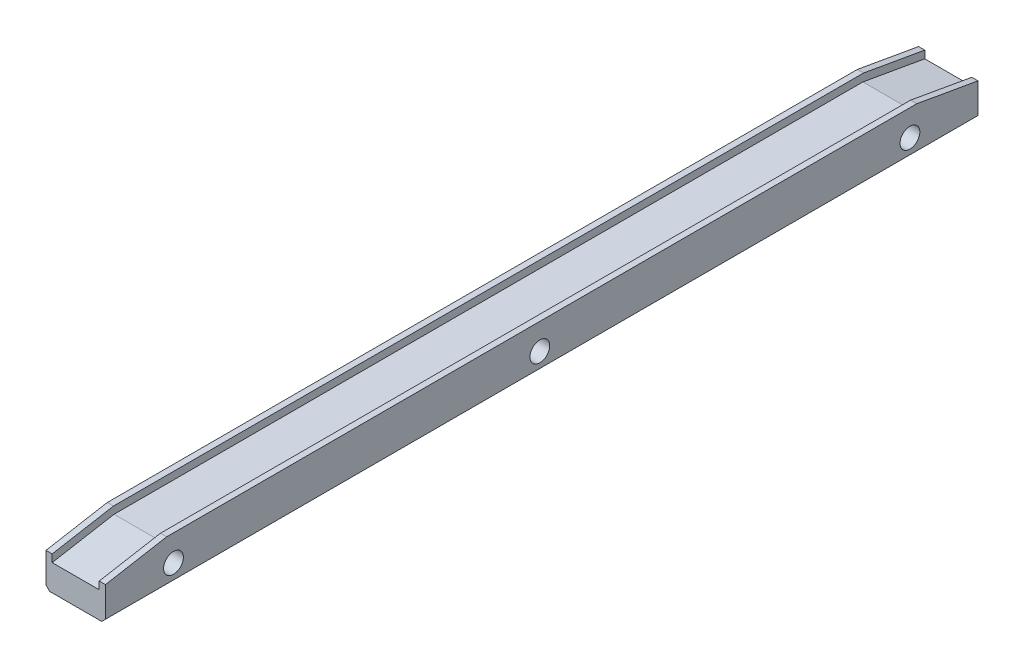
ISO-10303-21;
HEADER;
FILE_DESCRIPTION(('STEP AP214'),'2;1');
FILE_NAME('part.step','',(''),(''),'','','');
FILE_SCHEMA(('AUTOMOTIVE_DESIGN { 1 0 10303 214 1 1 1 1 }'));
ENDSEC;
DATA;
#1=APPLICATION_CONTEXT('core data for automotive mechanical design processes');
#2=APPLICATION_PROTOCOL_DEFINITION('international standard','automotive_design',2000,#1);
#3=PRODUCT_CONTEXT('',#1,'mechanical');
#4=PRODUCT('Part','Part','',(#3));
#5=PRODUCT_RELATED_PRODUCT_CATEGORY('part','',(#4));
#6=PRODUCT_DEFINITION_FORMATION('','',#4);
#7=PRODUCT_DEFINITION_CONTEXT('part definition',#1,'design');
#8=PRODUCT_DEFINITION('design','',#6,#7);
#9=PRODUCT_DEFINITION_SHAPE('','',#8);
#10=(LENGTH_UNIT() NAMED_UNIT(*) SI_UNIT(.MILLI.,.METRE.));
#11=(NAMED_UNIT(*) PLANE_ANGLE_UNIT() SI_UNIT($,.RADIAN.));
#12=(NAMED_UNIT(*) SI_UNIT($,.STERADIAN.) SOLID_ANGLE_UNIT());
#13=UNCERTAINTY_MEASURE_WITH_UNIT(LENGTH_MEASURE(1.E-05),#10,'distance_accuracy_value','');
#14=(GEOMETRIC_REPRESENTATION_CONTEXT(3) GLOBAL_UNCERTAINTY_ASSIGNED_CONTEXT((#13)) GLOBAL_UNIT_ASSIGNED_CONTEXT((#10,
#11,#12)) REPRESENTATION_CONTEXT('',''));
#15=CARTESIAN_POINT('',(0.,0.,0.));
#16=DIRECTION('',(0.,0.,1.));
#17=DIRECTION('',(1.,0.,0.));
#18=AXIS2_PLACEMENT_3D('',#15,#16,#17);
#19=CARTESIAN_POINT('',(-24.,6.,327.5));
#20=DIRECTION('',(1.,0.,0.));
#21=DIRECTION('',(0.,1.,0.));
#22=AXIS2_PLACEMENT_3D('',#19,#20,#21);
#23=PLANE('',#22);
#24=CARTESIAN_POINT('',(-24.,-15.,-297.5));
#25=DIRECTION('',(1.,0.,0.));
#26=DIRECTION('',(0.,1.,0.));
#27=AXIS2_PLACEMENT_3D('',#24,#25,#26);
#28=CIRCLE('',#27,7.99999999999998);
#29=CARTESIAN_POINT('',(-24.,-7.00000000000002,-297.5));
#30=VERTEX_POINT('',#29);
#31=EDGE_CURVE('E182',#30,#30,#28,.T.);
#32=ORIENTED_EDGE('',*,*,#31,.T.);
#33=EDGE_LOOP('',(#32));
#34=FACE_BOUND('',#33,.T.);
#35=CARTESIAN_POINT('',(-24.,-15.,297.5));
#36=DIRECTION('',(1.,0.,0.));
#37=DIRECTION('',(0.,1.,0.));
#38=AXIS2_PLACEMENT_3D('',#35,#36,#37);
#39=CIRCLE('',#38,7.99999999999998);
#40=CARTESIAN_POINT('',(-24.,-7.00000000000002,297.5));
#41=VERTEX_POINT('',#40);
#42=EDGE_CURVE('E187',#41,#41,#39,.T.);
#43=ORIENTED_EDGE('',*,*,#42,.T.);
#44=EDGE_LOOP('',(#43));
#45=FACE_BOUND('',#44,.T.);
#46=CARTESIAN_POINT('',(-24.,-15.,1.5));
#47=DIRECTION('',(1.,0.,0.));
#48=DIRECTION('',(0.,1.,0.));
#49=AXIS2_PLACEMENT_3D('',#46,#47,#48);
#50=CIRCLE('',#49,8.);
#51=CARTESIAN_POINT('',(-24.,-7.00000000000001,1.5));
#52=VERTEX_POINT('',#51);
#53=EDGE_CURVE('E287',#52,#52,#50,.T.);
#54=ORIENTED_EDGE('',*,*,#53,.T.);
#55=EDGE_LOOP('',(#54));
#56=FACE_BOUND('',#55,.T.);
#57=DIRECTION('',(0.,1.,0.));
#58=VECTOR('',#57,1.);
#59=CARTESIAN_POINT('',(-24.,-30.,-352.5));
#60=LINE('',#59,#58);
#61=CARTESIAN_POINT('',(-24.,-27.,-352.5));
#62=VERTEX_POINT('',#61);
#63=CARTESIAN_POINT('',(-24.,-2.72378936410878,-352.5));
#64=VERTEX_POINT('',#63);
#65=EDGE_CURVE('E254',#62,#64,#60,.T.);
#66=ORIENTED_EDGE('',*,*,#65,.F.);
#67=DIRECTION('',(0.,0.,1.));
#68=VECTOR('',#67,1.);
#69=CARTESIAN_POINT('',(-24.,-27.,327.5));
#70=LINE('',#69,#68);
#71=CARTESIAN_POINT('',(-24.,-27.,352.5));
#72=VERTEX_POINT('',#71);
#73=EDGE_CURVE('E65',#62,#72,#70,.T.);
#74=ORIENTED_EDGE('',*,*,#73,.T.);
#75=DIRECTION('',(0.,-1.,0.));
#76=VECTOR('',#75,1.);
#77=CARTESIAN_POINT('',(-24.,6.,352.5));
#78=LINE('',#77,#76);
#79=CARTESIAN_POINT('',(-24.,-2.72378936410878,352.5));
#80=VERTEX_POINT('',#79);
#81=EDGE_CURVE('E174',#80,#72,#78,.T.);
#82=ORIENTED_EDGE('',*,*,#81,.F.);
#83=DIRECTION('',(0.,0.173648177666928,-0.984807753012209));
#84=VECTOR('',#83,1.);
#85=CARTESIAN_POINT('',(-24.,-2.72378936410878,352.5));
#86=LINE('',#85,#84);
#87=CARTESIAN_POINT('',(-24.,6.,303.024931981155));
#88=VERTEX_POINT('',#87);
#89=EDGE_CURVE('E160',#80,#88,#86,.T.);
#90=ORIENTED_EDGE('',*,*,#89,.T.);
#91=DIRECTION('',(0.,0.,-1.));
#92=VECTOR('',#91,1.);
#93=CARTESIAN_POINT('',(-24.,6.,327.5));
#94=LINE('',#93,#92);
#95=CARTESIAN_POINT('',(-24.,6.,-303.024931981155));
#96=VERTEX_POINT('',#95);
#97=EDGE_CURVE('E173',#88,#96,#94,.T.);
#98=ORIENTED_EDGE('',*,*,#97,.T.);
#99=DIRECTION('',(0.,-0.173648177666928,-0.984807753012209));
#100=VECTOR('',#99,1.);
#101=CARTESIAN_POINT('',(-24.,-2.72378936410878,-352.5));
#102=LINE('',#101,#100);
#103=EDGE_CURVE('E257',#96,#64,#102,.T.);
#104=ORIENTED_EDGE('',*,*,#103,.T.);
#105=EDGE_LOOP('',(#66,#74,#82,#90,#98,#104));
#106=FACE_BOUND('',#105,.T.);
#107=ADVANCED_FACE('F41',(#34,#45,#56,#106),#23,.F.);
#108=CARTESIAN_POINT('',(24.,-30.,327.5));
#109=DIRECTION('',(0.,1.,0.));
#110=DIRECTION('',(0.,0.,1.));
#111=AXIS2_PLACEMENT_3D('',#108,#109,#110);
#112=PLANE('',#111);
#113=DIRECTION('',(1.,0.,0.));
#114=VECTOR('',#113,1.);
#115=CARTESIAN_POINT('',(-24.,-30.,352.5));
#116=LINE('',#115,#114);
#117=CARTESIAN_POINT('',(-21.,-30.,352.5));
#118=VERTEX_POINT('',#117);
#119=CARTESIAN_POINT('',(21.0000000000001,-30.,352.5));
#120=VERTEX_POINT('',#119);
#121=EDGE_CURVE('E240',#118,#120,#116,.T.);
#122=ORIENTED_EDGE('',*,*,#121,.F.);
#123=DIRECTION('',(0.,0.,-1.));
#124=VECTOR('',#123,1.);
#125=CARTESIAN_POINT('',(-21.,-30.,327.5));
#126=LINE('',#125,#124);
#127=CARTESIAN_POINT('',(-21.,-30.,-352.5));
#128=VERTEX_POINT('',#127);
#129=EDGE_CURVE('E229',#118,#128,#126,.T.);
#130=ORIENTED_EDGE('',*,*,#129,.T.);
#131=DIRECTION('',(-1.,0.,0.));
#132=VECTOR('',#131,1.);
#133=CARTESIAN_POINT('',(24.,-30.,-352.5));
#134=LINE('',#133,#132);
#135=CARTESIAN_POINT('',(21.0000000000001,-30.,-352.5));
#136=VERTEX_POINT('',#135);
#137=EDGE_CURVE('E256',#136,#128,#134,.T.);
#138=ORIENTED_EDGE('',*,*,#137,.F.);
#139=DIRECTION('',(0.,0.,1.));
#140=VECTOR('',#139,1.);
#141=CARTESIAN_POINT('',(21.0000000000001,-30.,327.5));
#142=LINE('',#141,#140);
#143=EDGE_CURVE('E227',#136,#120,#142,.T.);
#144=ORIENTED_EDGE('',*,*,#143,.T.);
#145=EDGE_LOOP('',(#122,#130,#138,#144));
#146=FACE_BOUND('',#145,.T.);
#147=ADVANCED_FACE('F244',(#146),#112,.F.);
#148=CARTESIAN_POINT('',(24.,6.,327.5));
#149=DIRECTION('',(-1.,0.,0.));
#150=DIRECTION('',(0.,-1.,0.));
#151=AXIS2_PLACEMENT_3D('',#148,#149,#150);
#152=PLANE('',#151);
#153=CARTESIAN_POINT('',(24.,-15.,-297.5));
#154=DIRECTION('',(1.,0.,0.));
#155=DIRECTION('',(0.,1.,0.));
#156=AXIS2_PLACEMENT_3D('',#153,#154,#155);
#157=CIRCLE('',#156,7.99999999999998);
#158=CARTESIAN_POINT('',(24.,-7.00000000000002,-297.5));
#159=VERTEX_POINT('',#158);
#160=EDGE_CURVE('E278',#159,#159,#157,.T.);
#161=ORIENTED_EDGE('',*,*,#160,.F.);
#162=EDGE_LOOP('',(#161));
#163=FACE_BOUND('',#162,.T.);
#164=CARTESIAN_POINT('',(24.,-15.,297.5));
#165=DIRECTION('',(1.,0.,0.));
#166=DIRECTION('',(0.,1.,0.));
#167=AXIS2_PLACEMENT_3D('',#164,#165,#166);
#168=CIRCLE('',#167,7.99999999999998);
#169=CARTESIAN_POINT('',(24.,-7.00000000000001,297.5));
#170=VERTEX_POINT('',#169);
#171=EDGE_CURVE('E279',#170,#170,#168,.T.);
#172=ORIENTED_EDGE('',*,*,#171,.F.);
#173=EDGE_LOOP('',(#172));
#174=FACE_BOUND('',#173,.T.);
#175=CARTESIAN_POINT('',(24.,-15.,1.5));
#176=DIRECTION('',(1.,0.,0.));
#177=DIRECTION('',(0.,1.,0.));
#178=AXIS2_PLACEMENT_3D('',#175,#176,#177);
#179=CIRCLE('',#178,8.);
#180=CARTESIAN_POINT('',(24.,-7.,1.5));
#181=VERTEX_POINT('',#180);
#182=EDGE_CURVE('E282',#181,#181,#179,.T.);
#183=ORIENTED_EDGE('',*,*,#182,.F.);
#184=EDGE_LOOP('',(#183));
#185=FACE_BOUND('',#184,.T.);
#186=DIRECTION('',(0.,1.,0.));
#187=VECTOR('',#186,1.);
#188=CARTESIAN_POINT('',(24.,-30.,352.5));
#189=LINE('',#188,#187);
#190=CARTESIAN_POINT('',(24.,-27.0000000000001,352.5));
#191=VERTEX_POINT('',#190);
#192=CARTESIAN_POINT('',(24.,-2.72378936410877,352.5));
#193=VERTEX_POINT('',#192);
#194=EDGE_CURVE('E248',#191,#193,#189,.T.);
#195=ORIENTED_EDGE('',*,*,#194,.F.);
#196=DIRECTION('',(0.,0.,-1.));
#197=VECTOR('',#196,1.);
#198=CARTESIAN_POINT('',(24.,-27.0000000000001,327.5));
#199=LINE('',#198,#197);
#200=CARTESIAN_POINT('',(24.,-27.0000000000001,-352.5));
#201=VERTEX_POINT('',#200);
#202=EDGE_CURVE('E11',#191,#201,#199,.T.);
#203=ORIENTED_EDGE('',*,*,#202,.T.);
#204=DIRECTION('',(0.,-1.,0.));
#205=VECTOR('',#204,1.);
#206=CARTESIAN_POINT('',(24.,6.,-352.5));
#207=LINE('',#206,#205);
#208=CARTESIAN_POINT('',(24.,-2.72378936410877,-352.5));
#209=VERTEX_POINT('',#208);
#210=EDGE_CURVE('E268',#209,#201,#207,.T.);
#211=ORIENTED_EDGE('',*,*,#210,.F.);
#212=DIRECTION('',(0.,-0.173648177666928,-0.984807753012209));
#213=VECTOR('',#212,1.);
#214=CARTESIAN_POINT('',(24.,-2.72378936410877,-352.5));
#215=LINE('',#214,#213);
#216=CARTESIAN_POINT('',(24.,6.,-303.024931981155));
#217=VERTEX_POINT('',#216);
#218=EDGE_CURVE('E607',#217,#209,#215,.T.);
#219=ORIENTED_EDGE('',*,*,#218,.F.);
#220=DIRECTION('',(0.,0.,-1.));
#221=VECTOR('',#220,1.);
#222=CARTESIAN_POINT('',(24.,6.,327.5));
#223=LINE('',#222,#221);
#224=CARTESIAN_POINT('',(24.,6.,303.024931981155));
#225=VERTEX_POINT('',#224);
#226=EDGE_CURVE('E199',#225,#217,#223,.T.);
#227=ORIENTED_EDGE('',*,*,#226,.F.);
#228=DIRECTION('',(0.,0.173648177666928,-0.984807753012209));
#229=VECTOR('',#228,1.);
#230=CARTESIAN_POINT('',(24.,-2.72378936410877,352.5));
#231=LINE('',#230,#229);
#232=EDGE_CURVE('E176',#193,#225,#231,.T.);
#233=ORIENTED_EDGE('',*,*,#232,.F.);
#234=EDGE_LOOP('',(#195,#203,#211,#219,#227,#233));
#235=FACE_BOUND('',#234,.T.);
#236=ADVANCED_FACE('F315',(#163,#174,#185,#235),#152,.F.);
#237=CARTESIAN_POINT('',(19.,6.,327.5));
#238=DIRECTION('',(0.,-1.,0.));
#239=DIRECTION('',(0.,0.,-1.));
#240=AXIS2_PLACEMENT_3D('',#237,#238,#239);
#241=PLANE('',#240);
#242=DIRECTION('',(0.,0.,-1.));
#243=VECTOR('',#242,1.);
#244=CARTESIAN_POINT('',(19.,6.,327.5));
#245=LINE('',#244,#243);
#246=CARTESIAN_POINT('',(19.,6.,303.024931981155));
#247=VERTEX_POINT('',#246);
#248=CARTESIAN_POINT('',(19.,6.,-303.024931981155));
#249=VERTEX_POINT('',#248);
#250=EDGE_CURVE('E196',#247,#249,#245,.T.);
#251=ORIENTED_EDGE('',*,*,#250,.F.);
#252=DIRECTION('',(1.,0.,0.));
#253=VECTOR('',#252,1.);
#254=CARTESIAN_POINT('',(-24.,6.,303.024931981155));
#255=LINE('',#254,#253);
#256=EDGE_CURVE('E169',#247,#225,#255,.T.);
#257=ORIENTED_EDGE('',*,*,#256,.T.);
#258=ORIENTED_EDGE('',*,*,#226,.T.);
#259=DIRECTION('',(1.,0.,0.));
#260=VECTOR('',#259,1.);
#261=CARTESIAN_POINT('',(-24.,6.,-303.024931981155));
#262=LINE('',#261,#260);
#263=EDGE_CURVE('E601',#249,#217,#262,.T.);
#264=ORIENTED_EDGE('',*,*,#263,.F.);
#265=EDGE_LOOP('',(#251,#257,#258,#264));
#266=FACE_BOUND('',#265,.T.);
#267=ADVANCED_FACE('F415',(#266),#241,.F.);
#268=CARTESIAN_POINT('',(19.,0.,327.5));
#269=DIRECTION('',(1.,0.,0.));
#270=DIRECTION('',(0.,0.,-1.));
#271=AXIS2_PLACEMENT_3D('',#268,#269,#270);
#272=PLANE('',#271);
#273=DIRECTION('',(0.,-1.,0.));
#274=VECTOR('',#273,1.);
#275=CARTESIAN_POINT('',(19.,6.,352.5));
#276=LINE('',#275,#274);
#277=CARTESIAN_POINT('',(19.,-2.72378936410878,352.5));
#278=VERTEX_POINT('',#277);
#279=CARTESIAN_POINT('',(19.,-8.81634903542323,352.5));
#280=VERTEX_POINT('',#279);
#281=EDGE_CURVE('E273',#278,#280,#276,.T.);
#282=ORIENTED_EDGE('',*,*,#281,.F.);
#283=DIRECTION('',(0.,0.173648177666927,-0.984807753012209));
#284=VECTOR('',#283,1.);
#285=CARTESIAN_POINT('',(19.,1.63359472650233,327.788046825825));
#286=LINE('',#285,#284);
#287=EDGE_CURVE('E262',#278,#247,#286,.T.);
#288=ORIENTED_EDGE('',*,*,#287,.T.);
#289=ORIENTED_EDGE('',*,*,#250,.T.);
#290=DIRECTION('',(0.,-0.173648177666927,-0.984807753012209));
#291=VECTOR('',#290,1.);
#292=CARTESIAN_POINT('',(19.,113.645191665657,307.46128648156));
#293=LINE('',#292,#291);
#294=CARTESIAN_POINT('',(19.,-2.72378936410877,-352.5));
#295=VERTEX_POINT('',#294);
#296=EDGE_CURVE('E587',#249,#295,#293,.T.);
#297=ORIENTED_EDGE('',*,*,#296,.T.);
#298=DIRECTION('',(0.,1.,0.));
#299=VECTOR('',#298,1.);
#300=CARTESIAN_POINT('',(19.,0.,-352.5));
#301=LINE('',#300,#299);
#302=CARTESIAN_POINT('',(19.,-8.81634903542323,-352.5));
#303=VERTEX_POINT('',#302);
#304=EDGE_CURVE('E260',#303,#295,#301,.T.);
#305=ORIENTED_EDGE('',*,*,#304,.F.);
#306=DIRECTION('',(0.,0.173648177666927,0.984807753012209));
#307=VECTOR('',#306,1.);
#308=CARTESIAN_POINT('',(19.,107.736345147584,308.503175547562));
#309=LINE('',#308,#307);
#310=CARTESIAN_POINT('',(19.,0.,-302.499999999999));
#311=VERTEX_POINT('',#310);
#312=EDGE_CURVE('E212',#303,#311,#309,.T.);
#313=ORIENTED_EDGE('',*,*,#312,.T.);
#314=DIRECTION('',(0.,0.,-1.));
#315=VECTOR('',#314,1.);
#316=CARTESIAN_POINT('',(19.,0.,327.5));
#317=LINE('',#316,#315);
#318=CARTESIAN_POINT('',(19.,0.,302.499999999999));
#319=VERTEX_POINT('',#318);
#320=EDGE_CURVE('E193',#319,#311,#317,.T.);
#321=ORIENTED_EDGE('',*,*,#320,.F.);
#322=DIRECTION('',(0.,-0.173648177666927,0.984807753012209));
#323=VECTOR('',#322,1.);
#324=CARTESIAN_POINT('',(19.,-4.27525179157092,326.746157759824));
#325=LINE('',#324,#323);
#326=EDGE_CURVE('E219',#319,#280,#325,.T.);
#327=ORIENTED_EDGE('',*,*,#326,.T.);
#328=EDGE_LOOP('',(#282,#288,#289,#297,#305,#313,#321,#327));
#329=FACE_BOUND('',#328,.T.);
#330=ADVANCED_FACE('F425',(#329),#272,.F.);
#331=CARTESIAN_POINT('',(-19.,0.,327.5));
#332=DIRECTION('',(0.,-1.,0.));
#333=DIRECTION('',(0.,0.,-1.));
#334=AXIS2_PLACEMENT_3D('',#331,#332,#333);
#335=PLANE('',#334);
#336=ORIENTED_EDGE('',*,*,#320,.T.);
#337=DIRECTION('',(-1.,0.,0.));
#338=VECTOR('',#337,1.);
#339=CARTESIAN_POINT('',(-19.,0.,-302.499999999999));
#340=LINE('',#339,#338);
#341=CARTESIAN_POINT('',(-19.,0.,-302.499999999999));
#342=VERTEX_POINT('',#341);
#343=EDGE_CURVE('E207',#311,#342,#340,.T.);
#344=ORIENTED_EDGE('',*,*,#343,.T.);
#345=DIRECTION('',(0.,0.,-1.));
#346=VECTOR('',#345,1.);
#347=CARTESIAN_POINT('',(-19.,0.,327.5));
#348=LINE('',#347,#346);
#349=CARTESIAN_POINT('',(-19.,0.,302.499999999999));
#350=VERTEX_POINT('',#349);
#351=EDGE_CURVE('E184',#350,#342,#348,.T.);
#352=ORIENTED_EDGE('',*,*,#351,.F.);
#353=DIRECTION('',(1.,0.,0.));
#354=VECTOR('',#353,1.);
#355=CARTESIAN_POINT('',(19.,0.,302.499999999999));
#356=LINE('',#355,#354);
#357=EDGE_CURVE('E205',#350,#319,#356,.T.);
#358=ORIENTED_EDGE('',*,*,#357,.T.);
#359=EDGE_LOOP('',(#336,#344,#352,#358));
#360=FACE_BOUND('',#359,.T.);
#361=ADVANCED_FACE('F432',(#360),#335,.F.);
#362=CARTESIAN_POINT('',(-19.,0.,327.5));
#363=DIRECTION('',(-1.,0.,0.));
#364=DIRECTION('',(0.,0.,1.));
#365=AXIS2_PLACEMENT_3D('',#362,#363,#364);
#366=PLANE('',#365);
#367=DIRECTION('',(0.,0.,-1.));
#368=VECTOR('',#367,1.);
#369=CARTESIAN_POINT('',(-19.,6.,327.5));
#370=LINE('',#369,#368);
#371=CARTESIAN_POINT('',(-19.,6.,303.024931981155));
#372=VERTEX_POINT('',#371);
#373=CARTESIAN_POINT('',(-19.,6.,-303.024931981155));
#374=VERTEX_POINT('',#373);
#375=EDGE_CURVE('E181',#372,#374,#370,.T.);
#376=ORIENTED_EDGE('',*,*,#375,.F.);
#377=DIRECTION('',(0.,-0.173648177666927,0.984807753012209));
#378=VECTOR('',#377,1.);
#379=CARTESIAN_POINT('',(-19.,1.63359472650232,327.788046825825));
#380=LINE('',#379,#378);
#381=CARTESIAN_POINT('',(-19.,-2.72378936410878,352.5));
#382=VERTEX_POINT('',#381);
#383=EDGE_CURVE('E163',#372,#382,#380,.T.);
#384=ORIENTED_EDGE('',*,*,#383,.T.);
#385=DIRECTION('',(0.,1.,0.));
#386=VECTOR('',#385,1.);
#387=CARTESIAN_POINT('',(-19.,0.,352.5));
#388=LINE('',#387,#386);
#389=CARTESIAN_POINT('',(-19.,-8.81634903542323,352.5));
#390=VERTEX_POINT('',#389);
#391=EDGE_CURVE('E275',#390,#382,#388,.T.);
#392=ORIENTED_EDGE('',*,*,#391,.F.);
#393=DIRECTION('',(0.,0.173648177666927,-0.984807753012209));
#394=VECTOR('',#393,1.);
#395=CARTESIAN_POINT('',(-19.,-4.27525179157092,326.746157759824));
#396=LINE('',#395,#394);
#397=EDGE_CURVE('E217',#390,#350,#396,.T.);
#398=ORIENTED_EDGE('',*,*,#397,.T.);
#399=ORIENTED_EDGE('',*,*,#351,.T.);
#400=DIRECTION('',(0.,-0.173648177666927,-0.984807753012209));
#401=VECTOR('',#400,1.);
#402=CARTESIAN_POINT('',(-19.,107.736345147584,308.503175547562));
#403=LINE('',#402,#401);
#404=CARTESIAN_POINT('',(-19.,-8.81634903542323,-352.5));
#405=VERTEX_POINT('',#404);
#406=EDGE_CURVE('E214',#342,#405,#403,.T.);
#407=ORIENTED_EDGE('',*,*,#406,.T.);
#408=DIRECTION('',(0.,-1.,0.));
#409=VECTOR('',#408,1.);
#410=CARTESIAN_POINT('',(-19.,6.,-352.5));
#411=LINE('',#410,#409);
#412=CARTESIAN_POINT('',(-19.,-2.72378936410878,-352.5));
#413=VERTEX_POINT('',#412);
#414=EDGE_CURVE('E258',#413,#405,#411,.T.);
#415=ORIENTED_EDGE('',*,*,#414,.F.);
#416=DIRECTION('',(0.,0.173648177666927,0.984807753012209));
#417=VECTOR('',#416,1.);
#418=CARTESIAN_POINT('',(-19.,113.645191665657,307.46128648156));
#419=LINE('',#418,#417);
#420=EDGE_CURVE('E168',#413,#374,#419,.T.);
#421=ORIENTED_EDGE('',*,*,#420,.T.);
#422=EDGE_LOOP('',(#376,#384,#392,#398,#399,#407,#415,#421));
#423=FACE_BOUND('',#422,.T.);
#424=ADVANCED_FACE('F440',(#423),#366,.F.);
#425=CARTESIAN_POINT('',(-19.,6.,327.5));
#426=DIRECTION('',(0.,-1.,0.));
#427=DIRECTION('',(0.,0.,-1.));
#428=AXIS2_PLACEMENT_3D('',#425,#426,#427);
#429=PLANE('',#428);
#430=ORIENTED_EDGE('',*,*,#97,.F.);
#431=EDGE_CURVE('E157',#88,#372,#255,.T.);
#432=ORIENTED_EDGE('',*,*,#431,.T.);
#433=ORIENTED_EDGE('',*,*,#375,.T.);
#434=EDGE_CURVE('E180',#96,#374,#262,.T.);
#435=ORIENTED_EDGE('',*,*,#434,.F.);
#436=EDGE_LOOP('',(#430,#432,#433,#435));
#437=FACE_BOUND('',#436,.T.);
#438=ADVANCED_FACE('F179',(#437),#429,.F.);
#439=CARTESIAN_POINT('',(-631.,-15.0000000000001,1.5));
#440=DIRECTION('',(1.,0.,0.));
#441=DIRECTION('',(0.,1.,0.));
#442=AXIS2_PLACEMENT_3D('',#439,#440,#441);
#443=CYLINDRICAL_SURFACE('',#442,8.);
#444=ORIENTED_EDGE('',*,*,#182,.T.);
#445=EDGE_LOOP('',(#444));
#446=FACE_BOUND('',#445,.T.);
#447=ORIENTED_EDGE('',*,*,#53,.F.);
#448=EDGE_LOOP('',(#447));
#449=FACE_BOUND('',#448,.T.);
#450=ADVANCED_FACE('F297',(#446,#449),#443,.F.);
#451=CARTESIAN_POINT('',(-631.,-15.0000000000001,297.5));
#452=DIRECTION('',(1.,0.,0.));
#453=DIRECTION('',(0.,1.,0.));
#454=AXIS2_PLACEMENT_3D('',#451,#452,#453);
#455=CYLINDRICAL_SURFACE('',#454,7.99999999999998);
#456=ORIENTED_EDGE('',*,*,#171,.T.);
#457=EDGE_LOOP('',(#456));
#458=FACE_BOUND('',#457,.T.);
#459=ORIENTED_EDGE('',*,*,#42,.F.);
#460=EDGE_LOOP('',(#459));
#461=FACE_BOUND('',#460,.T.);
#462=ADVANCED_FACE('F294',(#458,#461),#455,.F.);
#463=CARTESIAN_POINT('',(-631.,-15.0000000000001,-297.5));
#464=DIRECTION('',(1.,0.,0.));
#465=DIRECTION('',(0.,1.,0.));
#466=AXIS2_PLACEMENT_3D('',#463,#464,#465);
#467=CYLINDRICAL_SURFACE('',#466,7.99999999999998);
#468=ORIENTED_EDGE('',*,*,#160,.T.);
#469=EDGE_LOOP('',(#468));
#470=FACE_BOUND('',#469,.T.);
#471=ORIENTED_EDGE('',*,*,#31,.F.);
#472=EDGE_LOOP('',(#471));
#473=FACE_BOUND('',#472,.T.);
#474=ADVANCED_FACE('F296',(#470,#473),#467,.F.);
#475=CARTESIAN_POINT('',(0.,0.,352.5));
#476=DIRECTION('',(0.,0.,1.));
#477=DIRECTION('',(1.,0.,0.));
#478=AXIS2_PLACEMENT_3D('',#475,#476,#477);
#479=PLANE('',#478);
#480=ORIENTED_EDGE('',*,*,#81,.T.);
#481=DIRECTION('',(-0.707106781186548,0.707106781186547,0.));
#482=VECTOR('',#481,1.);
#483=CARTESIAN_POINT('',(-25.5,-25.5,352.5));
#484=LINE('',#483,#482);
#485=EDGE_CURVE('E50',#72,#118,#484,.F.);
#486=ORIENTED_EDGE('',*,*,#485,.T.);
#487=ORIENTED_EDGE('',*,*,#121,.T.);
#488=DIRECTION('',(-0.707106781186548,-0.707106781186548,0.));
#489=VECTOR('',#488,1.);
#490=CARTESIAN_POINT('',(25.5000000000001,-25.5000000000001,352.5));
#491=LINE('',#490,#489);
#492=EDGE_CURVE('E57',#120,#191,#491,.F.);
#493=ORIENTED_EDGE('',*,*,#492,.T.);
#494=ORIENTED_EDGE('',*,*,#194,.T.);
#495=DIRECTION('',(1.,0.,0.));
#496=VECTOR('',#495,1.);
#497=CARTESIAN_POINT('',(0.,-2.72378936410878,352.5));
#498=LINE('',#497,#496);
#499=EDGE_CURVE('E224',#278,#193,#498,.T.);
#500=ORIENTED_EDGE('',*,*,#499,.F.);
#501=ORIENTED_EDGE('',*,*,#281,.T.);
#502=DIRECTION('',(-1.,0.,0.));
#503=VECTOR('',#502,1.);
#504=CARTESIAN_POINT('',(-19.,-8.81634903542323,352.5));
#505=LINE('',#504,#503);
#506=EDGE_CURVE('E209',#280,#390,#505,.T.);
#507=ORIENTED_EDGE('',*,*,#506,.T.);
#508=ORIENTED_EDGE('',*,*,#391,.T.);
#509=DIRECTION('',(1.,0.,0.));
#510=VECTOR('',#509,1.);
#511=CARTESIAN_POINT('',(-24.,-2.72378936410878,352.5));
#512=LINE('',#511,#510);
#513=EDGE_CURVE('E175',#80,#382,#512,.T.);
#514=ORIENTED_EDGE('',*,*,#513,.F.);
#515=EDGE_LOOP('',(#480,#486,#487,#493,#494,#500,#501,#507,#508,#514));
#516=FACE_BOUND('',#515,.T.);
#517=ADVANCED_FACE('F239',(#516),#479,.T.);
#518=CARTESIAN_POINT('',(0.,0.,-352.5));
#519=DIRECTION('',(0.,0.,-1.));
#520=DIRECTION('',(-1.,0.,0.));
#521=AXIS2_PLACEMENT_3D('',#518,#519,#520);
#522=PLANE('',#521);
#523=ORIENTED_EDGE('',*,*,#137,.T.);
#524=DIRECTION('',(0.707106781186548,-0.707106781186547,0.));
#525=VECTOR('',#524,1.);
#526=CARTESIAN_POINT('',(-25.5,-25.5,-352.5));
#527=LINE('',#526,#525);
#528=EDGE_CURVE('E234',#128,#62,#527,.F.);
#529=ORIENTED_EDGE('',*,*,#528,.T.);
#530=ORIENTED_EDGE('',*,*,#65,.T.);
#531=DIRECTION('',(1.,0.,0.));
#532=VECTOR('',#531,1.);
#533=CARTESIAN_POINT('',(-24.,-2.72378936410878,-352.5));
#534=LINE('',#533,#532);
#535=EDGE_CURVE('E603',#64,#413,#534,.T.);
#536=ORIENTED_EDGE('',*,*,#535,.T.);
#537=ORIENTED_EDGE('',*,*,#414,.T.);
#538=DIRECTION('',(1.,0.,0.));
#539=VECTOR('',#538,1.);
#540=CARTESIAN_POINT('',(19.,-8.81634903542323,-352.5));
#541=LINE('',#540,#539);
#542=EDGE_CURVE('E202',#405,#303,#541,.T.);
#543=ORIENTED_EDGE('',*,*,#542,.T.);
#544=ORIENTED_EDGE('',*,*,#304,.T.);
#545=DIRECTION('',(-1.,0.,0.));
#546=VECTOR('',#545,1.);
#547=CARTESIAN_POINT('',(0.,-2.72378936410878,-352.5));
#548=LINE('',#547,#546);
#549=EDGE_CURVE('E222',#209,#295,#548,.T.);
#550=ORIENTED_EDGE('',*,*,#549,.F.);
#551=ORIENTED_EDGE('',*,*,#210,.T.);
#552=DIRECTION('',(0.707106781186548,0.707106781186548,0.));
#553=VECTOR('',#552,1.);
#554=CARTESIAN_POINT('',(25.5000000000001,-25.5000000000001,-352.5));
#555=LINE('',#554,#553);
#556=EDGE_CURVE('E232',#201,#136,#555,.F.);
#557=ORIENTED_EDGE('',*,*,#556,.T.);
#558=EDGE_LOOP('',(#523,#529,#530,#536,#537,#543,#544,#550,#551,#557));
#559=FACE_BOUND('',#558,.T.);
#560=ADVANCED_FACE('F252',(#559),#522,.T.);
#561=CARTESIAN_POINT('',(0.,-8.81634903542323,-352.5));
#562=DIRECTION('',(0.,0.984807753012209,-0.173648177666927));
#563=DIRECTION('',(-1.,0.,0.));
#564=AXIS2_PLACEMENT_3D('',#561,#562,#563);
#565=PLANE('',#564);
#566=ORIENTED_EDGE('',*,*,#406,.F.);
#567=ORIENTED_EDGE('',*,*,#343,.F.);
#568=ORIENTED_EDGE('',*,*,#312,.F.);
#569=ORIENTED_EDGE('',*,*,#542,.F.);
#570=EDGE_LOOP('',(#566,#567,#568,#569));
#571=FACE_BOUND('',#570,.T.);
#572=ADVANCED_FACE('F320',(#571),#565,.T.);
#573=CARTESIAN_POINT('',(0.,-8.81634903542323,352.5));
#574=DIRECTION('',(0.,0.984807753012209,0.173648177666927));
#575=DIRECTION('',(1.,0.,0.));
#576=AXIS2_PLACEMENT_3D('',#573,#574,#575);
#577=PLANE('',#576);
#578=ORIENTED_EDGE('',*,*,#326,.F.);
#579=ORIENTED_EDGE('',*,*,#357,.F.);
#580=ORIENTED_EDGE('',*,*,#397,.F.);
#581=ORIENTED_EDGE('',*,*,#506,.F.);
#582=EDGE_LOOP('',(#578,#579,#580,#581));
#583=FACE_BOUND('',#582,.T.);
#584=ADVANCED_FACE('F326',(#583),#577,.T.);
#585=CARTESIAN_POINT('',(-24.,-2.72378936410878,-352.5));
#586=DIRECTION('',(0.,-0.984807753012208,0.173648177666927));
#587=DIRECTION('',(0.,-0.173648177666927,-0.984807753012209));
#588=AXIS2_PLACEMENT_3D('',#585,#586,#587);
#589=PLANE('',#588);
#590=ORIENTED_EDGE('',*,*,#535,.F.);
#591=ORIENTED_EDGE('',*,*,#103,.F.);
#592=ORIENTED_EDGE('',*,*,#434,.T.);
#593=ORIENTED_EDGE('',*,*,#420,.F.);
#594=EDGE_LOOP('',(#590,#591,#592,#593));
#595=FACE_BOUND('',#594,.T.);
#596=ADVANCED_FACE('F332',(#595),#589,.F.);
#597=ORIENTED_EDGE('',*,*,#263,.T.);
#598=ORIENTED_EDGE('',*,*,#218,.T.);
#599=ORIENTED_EDGE('',*,*,#549,.T.);
#600=ORIENTED_EDGE('',*,*,#296,.F.);
#601=EDGE_LOOP('',(#597,#598,#599,#600));
#602=FACE_BOUND('',#601,.T.);
#603=ADVANCED_FACE('F347',(#602),#589,.F.);
#604=CARTESIAN_POINT('',(-24.,-2.72378936410878,352.5));
#605=DIRECTION('',(0.,-0.984807753012208,-0.173648177666927));
#606=DIRECTION('',(0.,0.173648177666927,-0.984807753012209));
#607=AXIS2_PLACEMENT_3D('',#604,#605,#606);
#608=PLANE('',#607);
#609=ORIENTED_EDGE('',*,*,#499,.T.);
#610=ORIENTED_EDGE('',*,*,#232,.T.);
#611=ORIENTED_EDGE('',*,*,#256,.F.);
#612=ORIENTED_EDGE('',*,*,#287,.F.);
#613=EDGE_LOOP('',(#609,#610,#611,#612));
#614=FACE_BOUND('',#613,.T.);
#615=ADVANCED_FACE('F342',(#614),#608,.F.);
#616=ORIENTED_EDGE('',*,*,#431,.F.);
#617=ORIENTED_EDGE('',*,*,#89,.F.);
#618=ORIENTED_EDGE('',*,*,#513,.T.);
#619=ORIENTED_EDGE('',*,*,#383,.F.);
#620=EDGE_LOOP('',(#616,#617,#618,#619));
#621=FACE_BOUND('',#620,.T.);
#622=ADVANCED_FACE('F159',(#621),#608,.F.);
#623=CARTESIAN_POINT('',(-21.,-30.,327.5));
#624=DIRECTION('',(0.707106781186547,0.707106781186548,0.));
#625=DIRECTION('',(0.,0.,-1.));
#626=AXIS2_PLACEMENT_3D('',#623,#624,#625);
#627=PLANE('',#626);
#628=ORIENTED_EDGE('',*,*,#485,.F.);
#629=ORIENTED_EDGE('',*,*,#73,.F.);
#630=ORIENTED_EDGE('',*,*,#528,.F.);
#631=ORIENTED_EDGE('',*,*,#129,.F.);
#632=EDGE_LOOP('',(#628,#629,#630,#631));
#633=FACE_BOUND('',#632,.T.);
#634=ADVANCED_FACE('F250',(#633),#627,.F.);
#635=CARTESIAN_POINT('',(24.,-27.0000000000001,327.5));
#636=DIRECTION('',(-0.707106781186547,0.707106781186547,0.));
#637=DIRECTION('',(0.,0.,-1.));
#638=AXIS2_PLACEMENT_3D('',#635,#636,#637);
#639=PLANE('',#638);
#640=ORIENTED_EDGE('',*,*,#492,.F.);
#641=ORIENTED_EDGE('',*,*,#143,.F.);
#642=ORIENTED_EDGE('',*,*,#556,.F.);
#643=ORIENTED_EDGE('',*,*,#202,.F.);
#644=EDGE_LOOP('',(#640,#641,#642,#643));
#645=FACE_BOUND('',#644,.T.);
#646=ADVANCED_FACE('F44',(#645),#639,.F.);
#647=CLOSED_SHELL('',(#107,#147,#236,#267,#330,#361,#424,#438,#450,#462,#474,#517,#560,#572,
#584,#596,#603,#615,#622,#634,#646));
#648=MANIFOLD_SOLID_BREP('B2',#647);
#649=ADVANCED_BREP_SHAPE_REPRESENTATION('',(#18,#648),#14);
#650=SHAPE_DEFINITION_REPRESENTATION(#9,#649);
ENDSEC;
END-ISO-10303-21;
